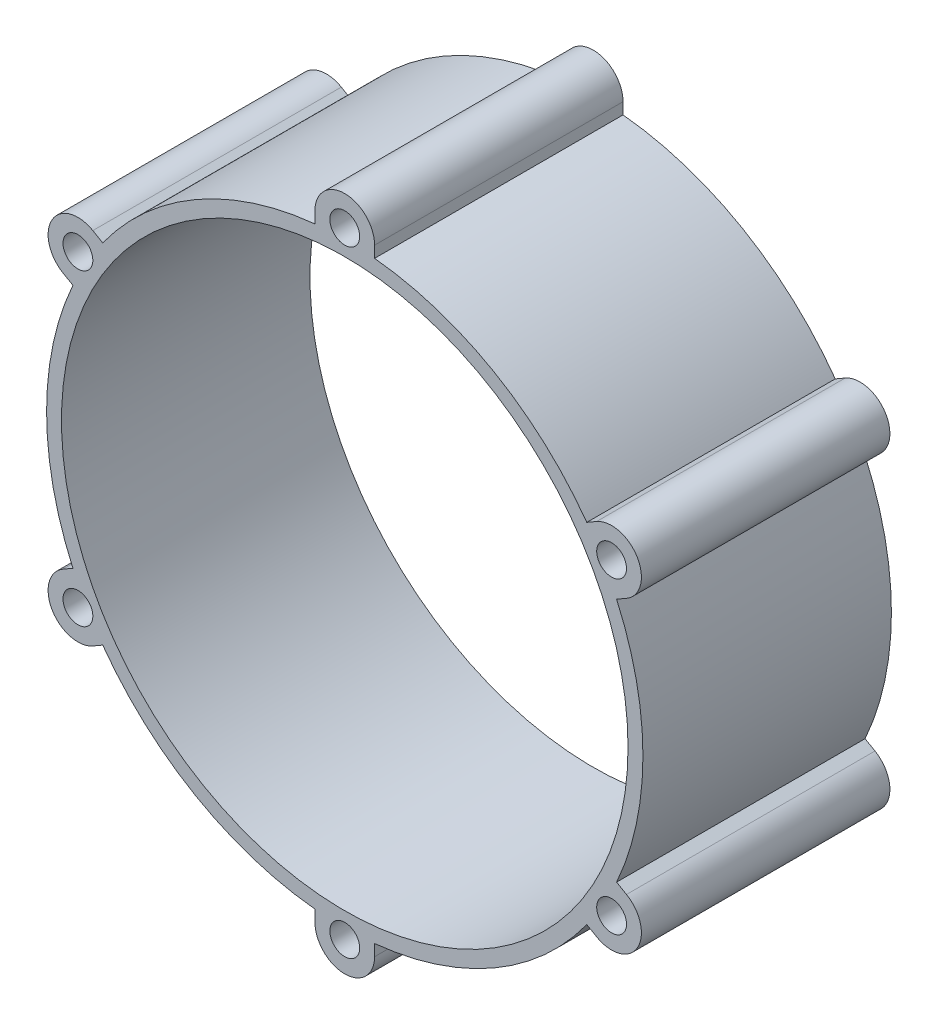
ISO-10303-21;
HEADER;
FILE_DESCRIPTION(('STEP AP214'),'2;1');
FILE_NAME('part.step','',(''),(''),'','','');
FILE_SCHEMA(('AUTOMOTIVE_DESIGN { 1 0 10303 214 1 1 1 1 }'));
ENDSEC;
DATA;
#1=APPLICATION_CONTEXT('core data for automotive mechanical design processes');
#2=APPLICATION_PROTOCOL_DEFINITION('international standard','automotive_design',2000,#1);
#3=PRODUCT_CONTEXT('',#1,'mechanical');
#4=PRODUCT('Part','Part','',(#3));
#5=PRODUCT_RELATED_PRODUCT_CATEGORY('part','',(#4));
#6=PRODUCT_DEFINITION_FORMATION('','',#4);
#7=PRODUCT_DEFINITION_CONTEXT('part definition',#1,'design');
#8=PRODUCT_DEFINITION('design','',#6,#7);
#9=PRODUCT_DEFINITION_SHAPE('','',#8);
#10=(LENGTH_UNIT() NAMED_UNIT(*) SI_UNIT(.MILLI.,.METRE.));
#11=(NAMED_UNIT(*) PLANE_ANGLE_UNIT() SI_UNIT($,.RADIAN.));
#12=(NAMED_UNIT(*) SI_UNIT($,.STERADIAN.) SOLID_ANGLE_UNIT());
#13=UNCERTAINTY_MEASURE_WITH_UNIT(LENGTH_MEASURE(1.E-05),#10,'distance_accuracy_value','');
#14=(GEOMETRIC_REPRESENTATION_CONTEXT(3) GLOBAL_UNCERTAINTY_ASSIGNED_CONTEXT((#13)) GLOBAL_UNIT_ASSIGNED_CONTEXT((#10,
#11,#12)) REPRESENTATION_CONTEXT('',''));
#15=CARTESIAN_POINT('',(0.,0.,0.));
#16=DIRECTION('',(0.,0.,1.));
#17=DIRECTION('',(1.,0.,0.));
#18=AXIS2_PLACEMENT_3D('',#15,#16,#17);
#19=CARTESIAN_POINT('',(0.,62.,25.));
#20=DIRECTION('',(0.,0.,-1.));
#21=DIRECTION('',(-1.,0.,0.));
#22=AXIS2_PLACEMENT_3D('',#19,#20,#21);
#23=CYLINDRICAL_SURFACE('',#22,6.);
#24=CARTESIAN_POINT('',(0.,62.,-25.));
#25=DIRECTION('',(0.,0.,1.));
#26=DIRECTION('',(1.,0.,0.));
#27=AXIS2_PLACEMENT_3D('',#24,#25,#26);
#28=CIRCLE('',#27,6.);
#29=CARTESIAN_POINT('',(6.,62.,-25.));
#30=VERTEX_POINT('',#29);
#31=CARTESIAN_POINT('',(-6.,62.,-25.));
#32=VERTEX_POINT('',#31);
#33=EDGE_CURVE('E427',#30,#32,#28,.T.);
#34=ORIENTED_EDGE('',*,*,#33,.T.);
#35=DIRECTION('',(0.,0.,-1.));
#36=VECTOR('',#35,1.);
#37=CARTESIAN_POINT('',(-6.,62.,25.));
#38=LINE('',#37,#36);
#39=CARTESIAN_POINT('',(-6.,62.,25.));
#40=VERTEX_POINT('',#39);
#41=EDGE_CURVE('E204',#40,#32,#38,.T.);
#42=ORIENTED_EDGE('',*,*,#41,.F.);
#43=CARTESIAN_POINT('',(0.,62.,25.));
#44=DIRECTION('',(0.,0.,1.));
#45=DIRECTION('',(1.,0.,0.));
#46=AXIS2_PLACEMENT_3D('',#43,#44,#45);
#47=CIRCLE('',#46,6.);
#48=CARTESIAN_POINT('',(6.,62.,25.));
#49=VERTEX_POINT('',#48);
#50=EDGE_CURVE('E418',#49,#40,#47,.T.);
#51=ORIENTED_EDGE('',*,*,#50,.F.);
#52=DIRECTION('',(0.,0.,-1.));
#53=VECTOR('',#52,1.);
#54=CARTESIAN_POINT('',(6.,62.,25.));
#55=LINE('',#54,#53);
#56=EDGE_CURVE('E12',#49,#30,#55,.T.);
#57=ORIENTED_EDGE('',*,*,#56,.T.);
#58=EDGE_LOOP('',(#34,#42,#51,#57));
#59=FACE_BOUND('',#58,.T.);
#60=ADVANCED_FACE('F194',(#59),#23,.T.);
#61=CARTESIAN_POINT('',(-5.99999999999986,0.,25.));
#62=DIRECTION('',(1.,0.,0.));
#63=DIRECTION('',(0.,1.,0.));
#64=AXIS2_PLACEMENT_3D('',#61,#62,#63);
#65=PLANE('',#64);
#66=DIRECTION('',(0.,-1.,0.));
#67=VECTOR('',#66,1.);
#68=CARTESIAN_POINT('',(-5.99999999999986,0.,-25.));
#69=LINE('',#68,#67);
#70=CARTESIAN_POINT('',(-6.,59.6992462263972,-25.));
#71=VERTEX_POINT('',#70);
#72=EDGE_CURVE('E419',#32,#71,#69,.T.);
#73=ORIENTED_EDGE('',*,*,#72,.T.);
#74=DIRECTION('',(0.,0.,-1.));
#75=VECTOR('',#74,1.);
#76=CARTESIAN_POINT('',(-6.,59.6992462263972,25.));
#77=LINE('',#76,#75);
#78=CARTESIAN_POINT('',(-6.,59.6992462263972,25.));
#79=VERTEX_POINT('',#78);
#80=EDGE_CURVE('E433',#79,#71,#77,.T.);
#81=ORIENTED_EDGE('',*,*,#80,.F.);
#82=DIRECTION('',(0.,-1.,0.));
#83=VECTOR('',#82,1.);
#84=CARTESIAN_POINT('',(-5.99999999999986,0.,25.));
#85=LINE('',#84,#83);
#86=EDGE_CURVE('E422',#40,#79,#85,.T.);
#87=ORIENTED_EDGE('',*,*,#86,.F.);
#88=ORIENTED_EDGE('',*,*,#41,.T.);
#89=EDGE_LOOP('',(#73,#81,#87,#88));
#90=FACE_BOUND('',#89,.T.);
#91=ADVANCED_FACE('F568',(#90),#65,.F.);
#92=CARTESIAN_POINT('',(5.99999999999986,0.,25.));
#93=DIRECTION('',(1.,0.,0.));
#94=DIRECTION('',(0.,1.,0.));
#95=AXIS2_PLACEMENT_3D('',#92,#93,#94);
#96=PLANE('',#95);
#97=DIRECTION('',(0.,-1.,0.));
#98=VECTOR('',#97,1.);
#99=CARTESIAN_POINT('',(5.99999999999986,0.,-25.));
#100=LINE('',#99,#98);
#101=CARTESIAN_POINT('',(6.,59.6992462263972,-25.));
#102=VERTEX_POINT('',#101);
#103=EDGE_CURVE('E425',#30,#102,#100,.T.);
#104=ORIENTED_EDGE('',*,*,#103,.F.);
#105=ORIENTED_EDGE('',*,*,#56,.F.);
#106=DIRECTION('',(0.,-1.,0.));
#107=VECTOR('',#106,1.);
#108=CARTESIAN_POINT('',(5.99999999999986,0.,25.));
#109=LINE('',#108,#107);
#110=CARTESIAN_POINT('',(6.,59.6992462263972,25.));
#111=VERTEX_POINT('',#110);
#112=EDGE_CURVE('E415',#49,#111,#109,.T.);
#113=ORIENTED_EDGE('',*,*,#112,.T.);
#114=DIRECTION('',(0.,0.,-1.));
#115=VECTOR('',#114,1.);
#116=CARTESIAN_POINT('',(6.,59.6992462263972,25.));
#117=LINE('',#116,#115);
#118=EDGE_CURVE('E213',#111,#102,#117,.T.);
#119=ORIENTED_EDGE('',*,*,#118,.T.);
#120=EDGE_LOOP('',(#104,#105,#113,#119));
#121=FACE_BOUND('',#120,.T.);
#122=ADVANCED_FACE('F574',(#121),#96,.T.);
#123=CARTESIAN_POINT('',(0.,0.,-25.));
#124=DIRECTION('',(0.,0.,1.));
#125=DIRECTION('',(1.,0.,0.));
#126=AXIS2_PLACEMENT_3D('',#123,#124,#125);
#127=PLANE('',#126);
#128=CARTESIAN_POINT('',(53.6935750346348,31.0000000000006,-25.));
#129=DIRECTION('',(0.,0.,-1.));
#130=DIRECTION('',(-0.50000000000001,0.866025403784433,0.));
#131=AXIS2_PLACEMENT_3D('',#128,#129,#130);
#132=CIRCLE('',#131,3.);
#133=CARTESIAN_POINT('',(52.1935750346348,33.5980762113539,-25.));
#134=VERTEX_POINT('',#133);
#135=EDGE_CURVE('E911',#134,#134,#132,.T.);
#136=ORIENTED_EDGE('',*,*,#135,.F.);
#137=EDGE_LOOP('',(#136));
#138=FACE_BOUND('',#137,.T.);
#139=CARTESIAN_POINT('',(53.6935750346355,-30.9999999999995,-25.));
#140=DIRECTION('',(0.,0.,-1.));
#141=DIRECTION('',(0.499999999999992,0.866025403784443,0.));
#142=AXIS2_PLACEMENT_3D('',#139,#140,#141);
#143=CIRCLE('',#142,3.);
#144=CARTESIAN_POINT('',(55.1935750346355,-28.4019237886462,-25.));
#145=VERTEX_POINT('',#144);
#146=EDGE_CURVE('E915',#145,#145,#143,.T.);
#147=ORIENTED_EDGE('',*,*,#146,.F.);
#148=EDGE_LOOP('',(#147));
#149=FACE_BOUND('',#148,.T.);
#150=CARTESIAN_POINT('',(0.,-62.,-25.));
#151=DIRECTION('',(0.,0.,-1.));
#152=DIRECTION('',(1.,0.,0.));
#153=AXIS2_PLACEMENT_3D('',#150,#151,#152);
#154=CIRCLE('',#153,3.);
#155=CARTESIAN_POINT('',(3.,-62.,-25.));
#156=VERTEX_POINT('',#155);
#157=EDGE_CURVE('E919',#156,#156,#154,.T.);
#158=ORIENTED_EDGE('',*,*,#157,.F.);
#159=EDGE_LOOP('',(#158));
#160=FACE_BOUND('',#159,.T.);
#161=CARTESIAN_POINT('',(-53.6935750346351,-31.0000000000003,-25.));
#162=DIRECTION('',(0.,0.,-1.));
#163=DIRECTION('',(0.500000000000004,-0.866025403784436,0.));
#164=AXIS2_PLACEMENT_3D('',#161,#162,#163);
#165=CIRCLE('',#164,3.);
#166=CARTESIAN_POINT('',(-52.193575034635,-33.5980762113536,-25.));
#167=VERTEX_POINT('',#166);
#168=EDGE_CURVE('E923',#167,#167,#165,.T.);
#169=ORIENTED_EDGE('',*,*,#168,.F.);
#170=EDGE_LOOP('',(#169));
#171=FACE_BOUND('',#170,.T.);
#172=CARTESIAN_POINT('',(-53.6935750346353,30.9999999999999,-25.));
#173=DIRECTION('',(0.,0.,-1.));
#174=DIRECTION('',(-0.499999999999998,-0.86602540378444,0.));
#175=AXIS2_PLACEMENT_3D('',#172,#173,#174);
#176=CIRCLE('',#175,3.);
#177=CARTESIAN_POINT('',(-55.1935750346353,28.4019237886466,-25.));
#178=VERTEX_POINT('',#177);
#179=EDGE_CURVE('E412',#178,#178,#176,.T.);
#180=ORIENTED_EDGE('',*,*,#179,.F.);
#181=EDGE_LOOP('',(#180));
#182=FACE_BOUND('',#181,.T.);
#183=CARTESIAN_POINT('',(0.,62.,-25.));
#184=DIRECTION('',(0.,0.,-1.));
#185=DIRECTION('',(-1.,0.,0.));
#186=AXIS2_PLACEMENT_3D('',#183,#184,#185);
#187=CIRCLE('',#186,3.);
#188=CARTESIAN_POINT('',(-3.,62.,-25.));
#189=VERTEX_POINT('',#188);
#190=EDGE_CURVE('E404',#189,#189,#187,.T.);
#191=ORIENTED_EDGE('',*,*,#190,.F.);
#192=EDGE_LOOP('',(#191));
#193=FACE_BOUND('',#192,.T.);
#194=ORIENTED_EDGE('',*,*,#103,.T.);
#195=CARTESIAN_POINT('',(0.,0.,-25.));
#196=DIRECTION('',(0.,0.,1.));
#197=DIRECTION('',(1.,0.,0.));
#198=AXIS2_PLACEMENT_3D('',#195,#196,#197);
#199=CIRCLE('',#198,60.);
#200=CARTESIAN_POINT('',(48.7010638188423,35.0457755359052,-25.));
#201=VERTEX_POINT('',#200);
#202=EDGE_CURVE('E198',#201,#102,#199,.T.);
#203=ORIENTED_EDGE('',*,*,#202,.F.);
#204=DIRECTION('',(-0.866025403784436,-0.500000000000005,0.));
#205=VECTOR('',#204,1.);
#206=CARTESIAN_POINT('',(-2.99999999999984,5.19615242270628,-25.));
#207=LINE('',#206,#205);
#208=CARTESIAN_POINT('',(50.6935750346352,36.1961524227066,-25.));
#209=VERTEX_POINT('',#208);
#210=EDGE_CURVE('E381',#209,#201,#207,.T.);
#211=ORIENTED_EDGE('',*,*,#210,.F.);
#212=CARTESIAN_POINT('',(53.6935750346352,31.,-25.));
#213=DIRECTION('',(0.,0.,1.));
#214=DIRECTION('',(1.,0.,0.));
#215=AXIS2_PLACEMENT_3D('',#212,#213,#214);
#216=CIRCLE('',#215,6.);
#217=CARTESIAN_POINT('',(56.6935750346352,25.8038475772934,-25.));
#218=VERTEX_POINT('',#217);
#219=EDGE_CURVE('E378',#218,#209,#216,.T.);
#220=ORIENTED_EDGE('',*,*,#219,.F.);
#221=DIRECTION('',(-0.86602540378444,-0.499999999999998,0.));
#222=VECTOR('',#221,1.);
#223=CARTESIAN_POINT('',(2.99999999999993,-5.19615242270654,-25.));
#224=LINE('',#223,#222);
#225=CARTESIAN_POINT('',(54.7010638188423,24.653470690492,-25.));
#226=VERTEX_POINT('',#225);
#227=EDGE_CURVE('E368',#218,#226,#224,.T.);
#228=ORIENTED_EDGE('',*,*,#227,.T.);
#229=CARTESIAN_POINT('',(54.7010638188423,-24.653470690492,-25.));
#230=VERTEX_POINT('',#229);
#231=EDGE_CURVE('E352',#230,#226,#199,.T.);
#232=ORIENTED_EDGE('',*,*,#231,.F.);
#233=DIRECTION('',(-0.86602540378444,0.499999999999998,0.));
#234=VECTOR('',#233,1.);
#235=CARTESIAN_POINT('',(2.99999999999992,5.19615242270652,-25.));
#236=LINE('',#235,#234);
#237=CARTESIAN_POINT('',(56.6935750346352,-25.8038475772934,-25.));
#238=VERTEX_POINT('',#237);
#239=EDGE_CURVE('E519',#238,#230,#236,.T.);
#240=ORIENTED_EDGE('',*,*,#239,.F.);
#241=CARTESIAN_POINT('',(53.6935750346352,-31.,-25.));
#242=DIRECTION('',(0.,0.,1.));
#243=DIRECTION('',(1.,0.,0.));
#244=AXIS2_PLACEMENT_3D('',#241,#242,#243);
#245=CIRCLE('',#244,6.);
#246=CARTESIAN_POINT('',(50.6935750346352,-36.1961524227067,-25.));
#247=VERTEX_POINT('',#246);
#248=EDGE_CURVE('E527',#247,#238,#245,.T.);
#249=ORIENTED_EDGE('',*,*,#248,.F.);
#250=DIRECTION('',(-0.866025403784437,0.500000000000003,0.));
#251=VECTOR('',#250,1.);
#252=CARTESIAN_POINT('',(-2.99999999999992,-5.19615242270645,-25.));
#253=LINE('',#252,#251);
#254=CARTESIAN_POINT('',(48.7010638188423,-35.0457755359053,-25.));
#255=VERTEX_POINT('',#254);
#256=EDGE_CURVE('E396',#247,#255,#253,.T.);
#257=ORIENTED_EDGE('',*,*,#256,.T.);
#258=CARTESIAN_POINT('',(6.,-59.6992462263972,-25.));
#259=VERTEX_POINT('',#258);
#260=EDGE_CURVE('E363',#259,#255,#199,.T.);
#261=ORIENTED_EDGE('',*,*,#260,.F.);
#262=DIRECTION('',(0.,1.,0.));
#263=VECTOR('',#262,1.);
#264=CARTESIAN_POINT('',(5.99999999999982,0.,-25.));
#265=LINE('',#264,#263);
#266=CARTESIAN_POINT('',(6.00000000000001,-62.0000000000001,-25.));
#267=VERTEX_POINT('',#266);
#268=EDGE_CURVE('E493',#267,#259,#265,.T.);
#269=ORIENTED_EDGE('',*,*,#268,.F.);
#270=CARTESIAN_POINT('',(0.,-62.0000000000001,-25.));
#271=DIRECTION('',(0.,0.,1.));
#272=DIRECTION('',(1.,0.,0.));
#273=AXIS2_PLACEMENT_3D('',#270,#271,#272);
#274=CIRCLE('',#273,6.);
#275=CARTESIAN_POINT('',(-6.,-62.0000000000001,-25.));
#276=VERTEX_POINT('',#275);
#277=EDGE_CURVE('E502',#276,#267,#274,.T.);
#278=ORIENTED_EDGE('',*,*,#277,.F.);
#279=DIRECTION('',(0.,1.,0.));
#280=VECTOR('',#279,1.);
#281=CARTESIAN_POINT('',(-5.99999999999981,0.,-25.));
#282=LINE('',#281,#280);
#283=CARTESIAN_POINT('',(-5.99999999999999,-59.6992462263972,-25.));
#284=VERTEX_POINT('',#283);
#285=EDGE_CURVE('E499',#276,#284,#282,.T.);
#286=ORIENTED_EDGE('',*,*,#285,.T.);
#287=CARTESIAN_POINT('',(-48.7010638188423,-35.0457755359053,-25.));
#288=VERTEX_POINT('',#287);
#289=EDGE_CURVE('E641',#288,#284,#199,.T.);
#290=ORIENTED_EDGE('',*,*,#289,.F.);
#291=DIRECTION('',(0.866025403784438,0.500000000000002,0.));
#292=VECTOR('',#291,1.);
#293=CARTESIAN_POINT('',(2.99999999999997,-5.19615242270656,-25.));
#294=LINE('',#293,#292);
#295=CARTESIAN_POINT('',(-50.6935750346352,-36.1961524227067,-25.));
#296=VERTEX_POINT('',#295);
#297=EDGE_CURVE('E467',#296,#288,#294,.T.);
#298=ORIENTED_EDGE('',*,*,#297,.F.);
#299=CARTESIAN_POINT('',(-53.6935750346352,-31.0000000000001,-25.));
#300=DIRECTION('',(0.,0.,1.));
#301=DIRECTION('',(1.,0.,0.));
#302=AXIS2_PLACEMENT_3D('',#299,#300,#301);
#303=CIRCLE('',#302,6.);
#304=CARTESIAN_POINT('',(-56.6935750346352,-25.8038475772934,-25.));
#305=VERTEX_POINT('',#304);
#306=EDGE_CURVE('E476',#305,#296,#303,.T.);
#307=ORIENTED_EDGE('',*,*,#306,.F.);
#308=DIRECTION('',(0.86602540378444,0.499999999999998,0.));
#309=VECTOR('',#308,1.);
#310=CARTESIAN_POINT('',(-2.99999999999991,5.19615242270649,-25.));
#311=LINE('',#310,#309);
#312=CARTESIAN_POINT('',(-54.7010638188423,-24.653470690492,-25.));
#313=VERTEX_POINT('',#312);
#314=EDGE_CURVE('E473',#305,#313,#311,.T.);
#315=ORIENTED_EDGE('',*,*,#314,.T.);
#316=CARTESIAN_POINT('',(-54.7010638188423,24.6534706904919,-25.));
#317=VERTEX_POINT('',#316);
#318=EDGE_CURVE('E638',#317,#313,#199,.T.);
#319=ORIENTED_EDGE('',*,*,#318,.F.);
#320=DIRECTION('',(0.86602540378444,-0.499999999999997,0.));
#321=VECTOR('',#320,1.);
#322=CARTESIAN_POINT('',(-2.99999999999992,-5.19615242270654,-25.));
#323=LINE('',#322,#321);
#324=CARTESIAN_POINT('',(-56.6935750346352,25.8038475772933,-25.));
#325=VERTEX_POINT('',#324);
#326=EDGE_CURVE('E441',#325,#317,#323,.T.);
#327=ORIENTED_EDGE('',*,*,#326,.F.);
#328=CARTESIAN_POINT('',(-53.6935750346352,30.9999999999999,-25.));
#329=DIRECTION('',(0.,0.,1.));
#330=DIRECTION('',(1.,0.,0.));
#331=AXIS2_PLACEMENT_3D('',#328,#329,#330);
#332=CIRCLE('',#331,6.);
#333=CARTESIAN_POINT('',(-50.6935750346353,36.1961524227066,-25.));
#334=VERTEX_POINT('',#333);
#335=EDGE_CURVE('E450',#334,#325,#332,.T.);
#336=ORIENTED_EDGE('',*,*,#335,.F.);
#337=DIRECTION('',(0.866025403784438,-0.500000000000002,0.));
#338=VECTOR('',#337,1.);
#339=CARTESIAN_POINT('',(2.99999999999991,5.19615242270645,-25.));
#340=LINE('',#339,#338);
#341=CARTESIAN_POINT('',(-48.7010638188423,35.0457755359052,-25.));
#342=VERTEX_POINT('',#341);
#343=EDGE_CURVE('E447',#334,#342,#340,.T.);
#344=ORIENTED_EDGE('',*,*,#343,.T.);
#345=EDGE_CURVE('E637',#71,#342,#199,.T.);
#346=ORIENTED_EDGE('',*,*,#345,.F.);
#347=ORIENTED_EDGE('',*,*,#72,.F.);
#348=ORIENTED_EDGE('',*,*,#33,.F.);
#349=EDGE_LOOP('',(#194,#203,#211,#220,#228,#232,#240,#249,#257,#261,#269,#278,#286,#290,#298,
#307,#315,#319,#327,#336,#344,#346,#347,#348));
#350=FACE_BOUND('',#349,.T.);
#351=CARTESIAN_POINT('',(0.,0.,-25.));
#352=DIRECTION('',(0.,0.,1.));
#353=DIRECTION('',(1.,0.,0.));
#354=AXIS2_PLACEMENT_3D('',#351,#352,#353);
#355=CIRCLE('',#354,57.);
#356=CARTESIAN_POINT('',(57.,0.,-25.));
#357=VERTEX_POINT('',#356);
#358=EDGE_CURVE('E399',#357,#357,#355,.T.);
#359=ORIENTED_EDGE('',*,*,#358,.T.);
#360=EDGE_LOOP('',(#359));
#361=FACE_BOUND('',#360,.T.);
#362=ADVANCED_FACE('F375',(#138,#149,#160,#171,#182,#193,#350,#361),#127,.F.);
#363=CARTESIAN_POINT('',(0.,0.,25.));
#364=DIRECTION('',(0.,0.,1.));
#365=DIRECTION('',(1.,0.,0.));
#366=AXIS2_PLACEMENT_3D('',#363,#364,#365);
#367=PLANE('',#366);
#368=CARTESIAN_POINT('',(53.6935750346348,31.0000000000006,25.));
#369=DIRECTION('',(0.,0.,-1.));
#370=DIRECTION('',(-0.50000000000001,0.866025403784433,0.));
#371=AXIS2_PLACEMENT_3D('',#368,#369,#370);
#372=CIRCLE('',#371,3.);
#373=CARTESIAN_POINT('',(52.1935750346348,33.5980762113539,25.));
#374=VERTEX_POINT('',#373);
#375=EDGE_CURVE('E946',#374,#374,#372,.T.);
#376=ORIENTED_EDGE('',*,*,#375,.T.);
#377=EDGE_LOOP('',(#376));
#378=FACE_BOUND('',#377,.T.);
#379=CARTESIAN_POINT('',(53.6935750346355,-30.9999999999995,25.));
#380=DIRECTION('',(0.,0.,-1.));
#381=DIRECTION('',(0.499999999999992,0.866025403784443,0.));
#382=AXIS2_PLACEMENT_3D('',#379,#380,#381);
#383=CIRCLE('',#382,3.);
#384=CARTESIAN_POINT('',(55.1935750346355,-28.4019237886462,25.));
#385=VERTEX_POINT('',#384);
#386=EDGE_CURVE('E942',#385,#385,#383,.T.);
#387=ORIENTED_EDGE('',*,*,#386,.T.);
#388=EDGE_LOOP('',(#387));
#389=FACE_BOUND('',#388,.T.);
#390=CARTESIAN_POINT('',(0.,-62.,25.));
#391=DIRECTION('',(0.,0.,-1.));
#392=DIRECTION('',(1.,0.,0.));
#393=AXIS2_PLACEMENT_3D('',#390,#391,#392);
#394=CIRCLE('',#393,3.);
#395=CARTESIAN_POINT('',(3.,-62.,25.));
#396=VERTEX_POINT('',#395);
#397=EDGE_CURVE('E936',#396,#396,#394,.T.);
#398=ORIENTED_EDGE('',*,*,#397,.T.);
#399=EDGE_LOOP('',(#398));
#400=FACE_BOUND('',#399,.T.);
#401=CARTESIAN_POINT('',(-53.6935750346351,-31.0000000000003,25.));
#402=DIRECTION('',(0.,0.,-1.));
#403=DIRECTION('',(0.500000000000004,-0.866025403784436,0.));
#404=AXIS2_PLACEMENT_3D('',#401,#402,#403);
#405=CIRCLE('',#404,3.);
#406=CARTESIAN_POINT('',(-52.193575034635,-33.5980762113536,25.));
#407=VERTEX_POINT('',#406);
#408=EDGE_CURVE('E930',#407,#407,#405,.T.);
#409=ORIENTED_EDGE('',*,*,#408,.T.);
#410=EDGE_LOOP('',(#409));
#411=FACE_BOUND('',#410,.T.);
#412=CARTESIAN_POINT('',(-53.6935750346353,30.9999999999999,25.));
#413=DIRECTION('',(0.,0.,-1.));
#414=DIRECTION('',(-0.499999999999998,-0.86602540378444,0.));
#415=AXIS2_PLACEMENT_3D('',#412,#413,#414);
#416=CIRCLE('',#415,3.);
#417=CARTESIAN_POINT('',(-55.1935750346353,28.4019237886466,25.));
#418=VERTEX_POINT('',#417);
#419=EDGE_CURVE('E409',#418,#418,#416,.T.);
#420=ORIENTED_EDGE('',*,*,#419,.T.);
#421=EDGE_LOOP('',(#420));
#422=FACE_BOUND('',#421,.T.);
#423=CARTESIAN_POINT('',(0.,62.,25.));
#424=DIRECTION('',(0.,0.,-1.));
#425=DIRECTION('',(-1.,0.,0.));
#426=AXIS2_PLACEMENT_3D('',#423,#424,#425);
#427=CIRCLE('',#426,3.);
#428=CARTESIAN_POINT('',(-3.,62.,25.));
#429=VERTEX_POINT('',#428);
#430=EDGE_CURVE('E401',#429,#429,#427,.T.);
#431=ORIENTED_EDGE('',*,*,#430,.T.);
#432=EDGE_LOOP('',(#431));
#433=FACE_BOUND('',#432,.T.);
#434=ORIENTED_EDGE('',*,*,#112,.F.);
#435=ORIENTED_EDGE('',*,*,#50,.T.);
#436=ORIENTED_EDGE('',*,*,#86,.T.);
#437=CARTESIAN_POINT('',(0.,0.,25.));
#438=DIRECTION('',(0.,0.,1.));
#439=DIRECTION('',(1.,0.,0.));
#440=AXIS2_PLACEMENT_3D('',#437,#438,#439);
#441=CIRCLE('',#440,60.);
#442=CARTESIAN_POINT('',(-48.7010638188423,35.0457755359052,25.));
#443=VERTEX_POINT('',#442);
#444=EDGE_CURVE('E383',#79,#443,#441,.T.);
#445=ORIENTED_EDGE('',*,*,#444,.T.);
#446=DIRECTION('',(0.866025403784438,-0.500000000000002,0.));
#447=VECTOR('',#446,1.);
#448=CARTESIAN_POINT('',(2.99999999999991,5.19615242270645,25.));
#449=LINE('',#448,#447);
#450=CARTESIAN_POINT('',(-50.6935750346353,36.1961524227066,25.));
#451=VERTEX_POINT('',#450);
#452=EDGE_CURVE('E437',#451,#443,#449,.T.);
#453=ORIENTED_EDGE('',*,*,#452,.F.);
#454=CARTESIAN_POINT('',(-53.6935750346352,30.9999999999999,25.));
#455=DIRECTION('',(0.,0.,1.));
#456=DIRECTION('',(1.,0.,0.));
#457=AXIS2_PLACEMENT_3D('',#454,#455,#456);
#458=CIRCLE('',#457,6.);
#459=CARTESIAN_POINT('',(-56.6935750346352,25.8038475772933,25.));
#460=VERTEX_POINT('',#459);
#461=EDGE_CURVE('E440',#451,#460,#458,.T.);
#462=ORIENTED_EDGE('',*,*,#461,.T.);
#463=DIRECTION('',(0.86602540378444,-0.499999999999997,0.));
#464=VECTOR('',#463,1.);
#465=CARTESIAN_POINT('',(-2.99999999999992,-5.19615242270654,25.));
#466=LINE('',#465,#464);
#467=CARTESIAN_POINT('',(-54.7010638188423,24.6534706904919,25.));
#468=VERTEX_POINT('',#467);
#469=EDGE_CURVE('E443',#460,#468,#466,.T.);
#470=ORIENTED_EDGE('',*,*,#469,.T.);
#471=CARTESIAN_POINT('',(-54.7010638188423,-24.653470690492,25.));
#472=VERTEX_POINT('',#471);
#473=EDGE_CURVE('E665',#468,#472,#441,.T.);
#474=ORIENTED_EDGE('',*,*,#473,.T.);
#475=DIRECTION('',(0.86602540378444,0.499999999999998,0.));
#476=VECTOR('',#475,1.);
#477=CARTESIAN_POINT('',(-2.99999999999991,5.19615242270649,25.));
#478=LINE('',#477,#476);
#479=CARTESIAN_POINT('',(-56.6935750346352,-25.8038475772934,25.));
#480=VERTEX_POINT('',#479);
#481=EDGE_CURVE('E463',#480,#472,#478,.T.);
#482=ORIENTED_EDGE('',*,*,#481,.F.);
#483=CARTESIAN_POINT('',(-53.6935750346352,-31.0000000000001,25.));
#484=DIRECTION('',(0.,0.,1.));
#485=DIRECTION('',(1.,0.,0.));
#486=AXIS2_PLACEMENT_3D('',#483,#484,#485);
#487=CIRCLE('',#486,6.);
#488=CARTESIAN_POINT('',(-50.6935750346352,-36.1961524227067,25.));
#489=VERTEX_POINT('',#488);
#490=EDGE_CURVE('E466',#480,#489,#487,.T.);
#491=ORIENTED_EDGE('',*,*,#490,.T.);
#492=DIRECTION('',(0.866025403784438,0.500000000000002,0.));
#493=VECTOR('',#492,1.);
#494=CARTESIAN_POINT('',(2.99999999999997,-5.19615242270656,25.));
#495=LINE('',#494,#493);
#496=CARTESIAN_POINT('',(-48.7010638188423,-35.0457755359053,25.));
#497=VERTEX_POINT('',#496);
#498=EDGE_CURVE('E469',#489,#497,#495,.T.);
#499=ORIENTED_EDGE('',*,*,#498,.T.);
#500=CARTESIAN_POINT('',(-5.99999999999999,-59.6992462263972,25.));
#501=VERTEX_POINT('',#500);
#502=EDGE_CURVE('E636',#497,#501,#441,.T.);
#503=ORIENTED_EDGE('',*,*,#502,.T.);
#504=DIRECTION('',(0.,1.,0.));
#505=VECTOR('',#504,1.);
#506=CARTESIAN_POINT('',(-5.99999999999981,0.,25.));
#507=LINE('',#506,#505);
#508=CARTESIAN_POINT('',(-6.,-62.0000000000001,25.));
#509=VERTEX_POINT('',#508);
#510=EDGE_CURVE('E489',#509,#501,#507,.T.);
#511=ORIENTED_EDGE('',*,*,#510,.F.);
#512=CARTESIAN_POINT('',(0.,-62.0000000000001,25.));
#513=DIRECTION('',(0.,0.,1.));
#514=DIRECTION('',(1.,0.,0.));
#515=AXIS2_PLACEMENT_3D('',#512,#513,#514);
#516=CIRCLE('',#515,6.);
#517=CARTESIAN_POINT('',(6.00000000000001,-62.0000000000001,25.));
#518=VERTEX_POINT('',#517);
#519=EDGE_CURVE('E492',#509,#518,#516,.T.);
#520=ORIENTED_EDGE('',*,*,#519,.T.);
#521=DIRECTION('',(0.,1.,0.));
#522=VECTOR('',#521,1.);
#523=CARTESIAN_POINT('',(5.99999999999982,0.,25.));
#524=LINE('',#523,#522);
#525=CARTESIAN_POINT('',(6.,-59.6992462263972,25.));
#526=VERTEX_POINT('',#525);
#527=EDGE_CURVE('E495',#518,#526,#524,.T.);
#528=ORIENTED_EDGE('',*,*,#527,.T.);
#529=CARTESIAN_POINT('',(48.7010638188423,-35.0457755359053,25.));
#530=VERTEX_POINT('',#529);
#531=EDGE_CURVE('E635',#526,#530,#441,.T.);
#532=ORIENTED_EDGE('',*,*,#531,.T.);
#533=DIRECTION('',(-0.866025403784437,0.500000000000003,0.));
#534=VECTOR('',#533,1.);
#535=CARTESIAN_POINT('',(-2.99999999999992,-5.19615242270645,25.));
#536=LINE('',#535,#534);
#537=CARTESIAN_POINT('',(50.6935750346352,-36.1961524227067,25.));
#538=VERTEX_POINT('',#537);
#539=EDGE_CURVE('E515',#538,#530,#536,.T.);
#540=ORIENTED_EDGE('',*,*,#539,.F.);
#541=CARTESIAN_POINT('',(53.6935750346352,-31.,25.));
#542=DIRECTION('',(0.,0.,1.));
#543=DIRECTION('',(1.,0.,0.));
#544=AXIS2_PLACEMENT_3D('',#541,#542,#543);
#545=CIRCLE('',#544,6.);
#546=CARTESIAN_POINT('',(56.6935750346352,-25.8038475772934,25.));
#547=VERTEX_POINT('',#546);
#548=EDGE_CURVE('E518',#538,#547,#545,.T.);
#549=ORIENTED_EDGE('',*,*,#548,.T.);
#550=DIRECTION('',(-0.86602540378444,0.499999999999998,0.));
#551=VECTOR('',#550,1.);
#552=CARTESIAN_POINT('',(2.99999999999992,5.19615242270652,25.));
#553=LINE('',#552,#551);
#554=CARTESIAN_POINT('',(54.7010638188423,-24.653470690492,25.));
#555=VERTEX_POINT('',#554);
#556=EDGE_CURVE('E521',#547,#555,#553,.T.);
#557=ORIENTED_EDGE('',*,*,#556,.T.);
#558=CARTESIAN_POINT('',(54.7010638188423,24.653470690492,25.));
#559=VERTEX_POINT('',#558);
#560=EDGE_CURVE('E384',#555,#559,#441,.T.);
#561=ORIENTED_EDGE('',*,*,#560,.T.);
#562=DIRECTION('',(-0.86602540378444,-0.499999999999998,0.));
#563=VECTOR('',#562,1.);
#564=CARTESIAN_POINT('',(2.99999999999993,-5.19615242270654,25.));
#565=LINE('',#564,#563);
#566=CARTESIAN_POINT('',(56.6935750346352,25.8038475772934,25.));
#567=VERTEX_POINT('',#566);
#568=EDGE_CURVE('E370',#567,#559,#565,.T.);
#569=ORIENTED_EDGE('',*,*,#568,.F.);
#570=CARTESIAN_POINT('',(53.6935750346352,31.,25.));
#571=DIRECTION('',(0.,0.,1.));
#572=DIRECTION('',(1.,0.,0.));
#573=AXIS2_PLACEMENT_3D('',#570,#571,#572);
#574=CIRCLE('',#573,6.);
#575=CARTESIAN_POINT('',(50.6935750346352,36.1961524227066,25.));
#576=VERTEX_POINT('',#575);
#577=EDGE_CURVE('E537',#567,#576,#574,.T.);
#578=ORIENTED_EDGE('',*,*,#577,.T.);
#579=DIRECTION('',(-0.866025403784436,-0.500000000000005,0.));
#580=VECTOR('',#579,1.);
#581=CARTESIAN_POINT('',(-2.99999999999984,5.19615242270628,25.));
#582=LINE('',#581,#580);
#583=CARTESIAN_POINT('',(48.7010638188423,35.0457755359052,25.));
#584=VERTEX_POINT('',#583);
#585=EDGE_CURVE('E371',#576,#584,#582,.T.);
#586=ORIENTED_EDGE('',*,*,#585,.T.);
#587=EDGE_CURVE('E379',#584,#111,#441,.T.);
#588=ORIENTED_EDGE('',*,*,#587,.T.);
#589=EDGE_LOOP('',(#434,#435,#436,#445,#453,#462,#470,#474,#482,#491,#499,#503,#511,#520,#528,
#532,#540,#549,#557,#561,#569,#578,#586,#588));
#590=FACE_BOUND('',#589,.T.);
#591=CARTESIAN_POINT('',(0.,0.,25.));
#592=DIRECTION('',(0.,0.,1.));
#593=DIRECTION('',(1.,0.,0.));
#594=AXIS2_PLACEMENT_3D('',#591,#592,#593);
#595=CIRCLE('',#594,57.);
#596=CARTESIAN_POINT('',(57.,0.,25.));
#597=VERTEX_POINT('',#596);
#598=EDGE_CURVE('E364',#597,#597,#595,.T.);
#599=ORIENTED_EDGE('',*,*,#598,.F.);
#600=EDGE_LOOP('',(#599));
#601=FACE_BOUND('',#600,.T.);
#602=ADVANCED_FACE('F544',(#378,#389,#400,#411,#422,#433,#590,#601),#367,.T.);
#603=CARTESIAN_POINT('',(-53.6935750346352,30.9999999999999,25.));
#604=DIRECTION('',(0.,0.,-1.));
#605=DIRECTION('',(-1.,0.,0.));
#606=AXIS2_PLACEMENT_3D('',#603,#604,#605);
#607=CYLINDRICAL_SURFACE('',#606,6.);
#608=ORIENTED_EDGE('',*,*,#335,.T.);
#609=DIRECTION('',(0.,0.,-1.));
#610=VECTOR('',#609,1.);
#611=CARTESIAN_POINT('',(-56.6935750346352,25.8038475772933,25.));
#612=LINE('',#611,#610);
#613=EDGE_CURVE('E459',#460,#325,#612,.T.);
#614=ORIENTED_EDGE('',*,*,#613,.F.);
#615=ORIENTED_EDGE('',*,*,#461,.F.);
#616=DIRECTION('',(0.,0.,-1.));
#617=VECTOR('',#616,1.);
#618=CARTESIAN_POINT('',(-50.6935750346353,36.1961524227066,25.));
#619=LINE('',#618,#617);
#620=EDGE_CURVE('E428',#451,#334,#619,.T.);
#621=ORIENTED_EDGE('',*,*,#620,.T.);
#622=EDGE_LOOP('',(#608,#614,#615,#621));
#623=FACE_BOUND('',#622,.T.);
#624=ADVANCED_FACE('F557',(#623),#607,.T.);
#625=CARTESIAN_POINT('',(-2.99999999999992,-5.19615242270654,25.));
#626=DIRECTION('',(0.499999999999997,0.86602540378444,0.));
#627=DIRECTION('',(-0.86602540378444,0.499999999999997,0.));
#628=AXIS2_PLACEMENT_3D('',#625,#626,#627);
#629=PLANE('',#628);
#630=ORIENTED_EDGE('',*,*,#326,.T.);
#631=DIRECTION('',(0.,0.,-1.));
#632=VECTOR('',#631,1.);
#633=CARTESIAN_POINT('',(-54.7010638188423,24.6534706904919,25.));
#634=LINE('',#633,#632);
#635=EDGE_CURVE('E457',#468,#317,#634,.T.);
#636=ORIENTED_EDGE('',*,*,#635,.F.);
#637=ORIENTED_EDGE('',*,*,#469,.F.);
#638=ORIENTED_EDGE('',*,*,#613,.T.);
#639=EDGE_LOOP('',(#630,#636,#637,#638));
#640=FACE_BOUND('',#639,.T.);
#641=ADVANCED_FACE('F582',(#640),#629,.F.);
#642=CARTESIAN_POINT('',(-53.6935750346352,-31.0000000000001,25.));
#643=DIRECTION('',(0.,0.,-1.));
#644=DIRECTION('',(-1.,0.,0.));
#645=AXIS2_PLACEMENT_3D('',#642,#643,#644);
#646=CYLINDRICAL_SURFACE('',#645,6.);
#647=ORIENTED_EDGE('',*,*,#306,.T.);
#648=DIRECTION('',(0.,0.,-1.));
#649=VECTOR('',#648,1.);
#650=CARTESIAN_POINT('',(-50.6935750346352,-36.1961524227067,25.));
#651=LINE('',#650,#649);
#652=EDGE_CURVE('E485',#489,#296,#651,.T.);
#653=ORIENTED_EDGE('',*,*,#652,.F.);
#654=ORIENTED_EDGE('',*,*,#490,.F.);
#655=DIRECTION('',(0.,0.,-1.));
#656=VECTOR('',#655,1.);
#657=CARTESIAN_POINT('',(-56.6935750346352,-25.8038475772934,25.));
#658=LINE('',#657,#656);
#659=EDGE_CURVE('E451',#480,#305,#658,.T.);
#660=ORIENTED_EDGE('',*,*,#659,.T.);
#661=EDGE_LOOP('',(#647,#653,#654,#660));
#662=FACE_BOUND('',#661,.T.);
#663=ADVANCED_FACE('F585',(#662),#646,.T.);
#664=CARTESIAN_POINT('',(-2.99999999999991,5.19615242270649,25.));
#665=DIRECTION('',(-0.499999999999998,0.86602540378444,0.));
#666=DIRECTION('',(-0.86602540378444,-0.499999999999998,0.));
#667=AXIS2_PLACEMENT_3D('',#664,#665,#666);
#668=PLANE('',#667);
#669=ORIENTED_EDGE('',*,*,#314,.F.);
#670=ORIENTED_EDGE('',*,*,#659,.F.);
#671=ORIENTED_EDGE('',*,*,#481,.T.);
#672=DIRECTION('',(0.,0.,-1.));
#673=VECTOR('',#672,1.);
#674=CARTESIAN_POINT('',(-54.7010638188423,-24.653470690492,25.));
#675=LINE('',#674,#673);
#676=EDGE_CURVE('E472',#472,#313,#675,.T.);
#677=ORIENTED_EDGE('',*,*,#676,.T.);
#678=EDGE_LOOP('',(#669,#670,#671,#677));
#679=FACE_BOUND('',#678,.T.);
#680=ADVANCED_FACE('F597',(#679),#668,.T.);
#681=CARTESIAN_POINT('',(2.99999999999997,-5.19615242270656,25.));
#682=DIRECTION('',(-0.500000000000002,0.866025403784438,0.));
#683=DIRECTION('',(-0.866025403784438,-0.500000000000002,0.));
#684=AXIS2_PLACEMENT_3D('',#681,#682,#683);
#685=PLANE('',#684);
#686=ORIENTED_EDGE('',*,*,#297,.T.);
#687=DIRECTION('',(0.,0.,-1.));
#688=VECTOR('',#687,1.);
#689=CARTESIAN_POINT('',(-48.7010638188423,-35.0457755359053,25.));
#690=LINE('',#689,#688);
#691=EDGE_CURVE('E483',#497,#288,#690,.T.);
#692=ORIENTED_EDGE('',*,*,#691,.F.);
#693=ORIENTED_EDGE('',*,*,#498,.F.);
#694=ORIENTED_EDGE('',*,*,#652,.T.);
#695=EDGE_LOOP('',(#686,#692,#693,#694));
#696=FACE_BOUND('',#695,.T.);
#697=ADVANCED_FACE('F593',(#696),#685,.F.);
#698=CARTESIAN_POINT('',(0.,-62.0000000000001,25.));
#699=DIRECTION('',(0.,0.,-1.));
#700=DIRECTION('',(-1.,0.,0.));
#701=AXIS2_PLACEMENT_3D('',#698,#699,#700);
#702=CYLINDRICAL_SURFACE('',#701,6.);
#703=ORIENTED_EDGE('',*,*,#277,.T.);
#704=DIRECTION('',(0.,0.,-1.));
#705=VECTOR('',#704,1.);
#706=CARTESIAN_POINT('',(6.00000000000001,-62.0000000000001,25.));
#707=LINE('',#706,#705);
#708=EDGE_CURVE('E511',#518,#267,#707,.T.);
#709=ORIENTED_EDGE('',*,*,#708,.F.);
#710=ORIENTED_EDGE('',*,*,#519,.F.);
#711=DIRECTION('',(0.,0.,-1.));
#712=VECTOR('',#711,1.);
#713=CARTESIAN_POINT('',(-6.,-62.0000000000001,25.));
#714=LINE('',#713,#712);
#715=EDGE_CURVE('E477',#509,#276,#714,.T.);
#716=ORIENTED_EDGE('',*,*,#715,.T.);
#717=EDGE_LOOP('',(#703,#709,#710,#716));
#718=FACE_BOUND('',#717,.T.);
#719=ADVANCED_FACE('F596',(#718),#702,.T.);
#720=CARTESIAN_POINT('',(-5.99999999999981,0.,25.));
#721=DIRECTION('',(-1.,0.,0.));
#722=DIRECTION('',(0.,-1.,0.));
#723=AXIS2_PLACEMENT_3D('',#720,#721,#722);
#724=PLANE('',#723);
#725=ORIENTED_EDGE('',*,*,#285,.F.);
#726=ORIENTED_EDGE('',*,*,#715,.F.);
#727=ORIENTED_EDGE('',*,*,#510,.T.);
#728=DIRECTION('',(0.,0.,-1.));
#729=VECTOR('',#728,1.);
#730=CARTESIAN_POINT('',(-5.99999999999999,-59.6992462263972,25.));
#731=LINE('',#730,#729);
#732=EDGE_CURVE('E498',#501,#284,#731,.T.);
#733=ORIENTED_EDGE('',*,*,#732,.T.);
#734=EDGE_LOOP('',(#725,#726,#727,#733));
#735=FACE_BOUND('',#734,.T.);
#736=ADVANCED_FACE('F610',(#735),#724,.T.);
#737=CARTESIAN_POINT('',(5.99999999999982,0.,25.));
#738=DIRECTION('',(-1.,0.,0.));
#739=DIRECTION('',(0.,-1.,0.));
#740=AXIS2_PLACEMENT_3D('',#737,#738,#739);
#741=PLANE('',#740);
#742=ORIENTED_EDGE('',*,*,#268,.T.);
#743=DIRECTION('',(0.,0.,-1.));
#744=VECTOR('',#743,1.);
#745=CARTESIAN_POINT('',(6.,-59.6992462263972,25.));
#746=LINE('',#745,#744);
#747=EDGE_CURVE('E509',#526,#259,#746,.T.);
#748=ORIENTED_EDGE('',*,*,#747,.F.);
#749=ORIENTED_EDGE('',*,*,#527,.F.);
#750=ORIENTED_EDGE('',*,*,#708,.T.);
#751=EDGE_LOOP('',(#742,#748,#749,#750));
#752=FACE_BOUND('',#751,.T.);
#753=ADVANCED_FACE('F606',(#752),#741,.F.);
#754=CARTESIAN_POINT('',(53.6935750346352,-31.,25.));
#755=DIRECTION('',(0.,0.,-1.));
#756=DIRECTION('',(-1.,0.,0.));
#757=AXIS2_PLACEMENT_3D('',#754,#755,#756);
#758=CYLINDRICAL_SURFACE('',#757,6.);
#759=ORIENTED_EDGE('',*,*,#248,.T.);
#760=DIRECTION('',(0.,0.,-1.));
#761=VECTOR('',#760,1.);
#762=CARTESIAN_POINT('',(56.6935750346352,-25.8038475772934,25.));
#763=LINE('',#762,#761);
#764=EDGE_CURVE('E533',#547,#238,#763,.T.);
#765=ORIENTED_EDGE('',*,*,#764,.F.);
#766=ORIENTED_EDGE('',*,*,#548,.F.);
#767=DIRECTION('',(0.,0.,-1.));
#768=VECTOR('',#767,1.);
#769=CARTESIAN_POINT('',(50.6935750346352,-36.1961524227067,25.));
#770=LINE('',#769,#768);
#771=EDGE_CURVE('E503',#538,#247,#770,.T.);
#772=ORIENTED_EDGE('',*,*,#771,.T.);
#773=EDGE_LOOP('',(#759,#765,#766,#772));
#774=FACE_BOUND('',#773,.T.);
#775=ADVANCED_FACE('F609',(#774),#758,.T.);
#776=CARTESIAN_POINT('',(-2.99999999999992,-5.19615242270645,25.));
#777=DIRECTION('',(-0.500000000000003,-0.866025403784437,0.));
#778=DIRECTION('',(0.866025403784437,-0.500000000000003,0.));
#779=AXIS2_PLACEMENT_3D('',#776,#777,#778);
#780=PLANE('',#779);
#781=ORIENTED_EDGE('',*,*,#256,.F.);
#782=ORIENTED_EDGE('',*,*,#771,.F.);
#783=ORIENTED_EDGE('',*,*,#539,.T.);
#784=DIRECTION('',(0.,0.,-1.));
#785=VECTOR('',#784,1.);
#786=CARTESIAN_POINT('',(48.7010638188423,-35.0457755359053,25.));
#787=LINE('',#786,#785);
#788=EDGE_CURVE('E524',#530,#255,#787,.T.);
#789=ORIENTED_EDGE('',*,*,#788,.T.);
#790=EDGE_LOOP('',(#781,#782,#783,#789));
#791=FACE_BOUND('',#790,.T.);
#792=ADVANCED_FACE('F564',(#791),#780,.T.);
#793=CARTESIAN_POINT('',(2.99999999999992,5.19615242270652,25.));
#794=DIRECTION('',(-0.499999999999998,-0.86602540378444,0.));
#795=DIRECTION('',(0.86602540378444,-0.499999999999998,0.));
#796=AXIS2_PLACEMENT_3D('',#793,#794,#795);
#797=PLANE('',#796);
#798=ORIENTED_EDGE('',*,*,#239,.T.);
#799=DIRECTION('',(0.,0.,-1.));
#800=VECTOR('',#799,1.);
#801=CARTESIAN_POINT('',(54.7010638188423,-24.653470690492,25.));
#802=LINE('',#801,#800);
#803=EDGE_CURVE('E358',#555,#230,#802,.T.);
#804=ORIENTED_EDGE('',*,*,#803,.F.);
#805=ORIENTED_EDGE('',*,*,#556,.F.);
#806=ORIENTED_EDGE('',*,*,#764,.T.);
#807=EDGE_LOOP('',(#798,#804,#805,#806));
#808=FACE_BOUND('',#807,.T.);
#809=ADVANCED_FACE('F618',(#808),#797,.F.);
#810=CARTESIAN_POINT('',(53.6935750346352,31.,25.));
#811=DIRECTION('',(0.,0.,-1.));
#812=DIRECTION('',(-1.,0.,0.));
#813=AXIS2_PLACEMENT_3D('',#810,#811,#812);
#814=CYLINDRICAL_SURFACE('',#813,6.);
#815=ORIENTED_EDGE('',*,*,#219,.T.);
#816=DIRECTION('',(0.,0.,-1.));
#817=VECTOR('',#816,1.);
#818=CARTESIAN_POINT('',(50.6935750346352,36.1961524227066,25.));
#819=LINE('',#818,#817);
#820=EDGE_CURVE('E391',#576,#209,#819,.T.);
#821=ORIENTED_EDGE('',*,*,#820,.F.);
#822=ORIENTED_EDGE('',*,*,#577,.F.);
#823=DIRECTION('',(0.,0.,-1.));
#824=VECTOR('',#823,1.);
#825=CARTESIAN_POINT('',(56.6935750346352,25.8038475772934,25.));
#826=LINE('',#825,#824);
#827=EDGE_CURVE('E394',#567,#218,#826,.T.);
#828=ORIENTED_EDGE('',*,*,#827,.T.);
#829=EDGE_LOOP('',(#815,#821,#822,#828));
#830=FACE_BOUND('',#829,.T.);
#831=ADVANCED_FACE('F563',(#830),#814,.T.);
#832=CARTESIAN_POINT('',(2.99999999999993,-5.19615242270654,25.));
#833=DIRECTION('',(0.499999999999998,-0.86602540378444,0.));
#834=DIRECTION('',(0.86602540378444,0.499999999999998,0.));
#835=AXIS2_PLACEMENT_3D('',#832,#833,#834);
#836=PLANE('',#835);
#837=ORIENTED_EDGE('',*,*,#227,.F.);
#838=ORIENTED_EDGE('',*,*,#827,.F.);
#839=ORIENTED_EDGE('',*,*,#568,.T.);
#840=DIRECTION('',(0.,0.,-1.));
#841=VECTOR('',#840,1.);
#842=CARTESIAN_POINT('',(54.7010638188423,24.653470690492,25.));
#843=LINE('',#842,#841);
#844=EDGE_CURVE('E356',#559,#226,#843,.T.);
#845=ORIENTED_EDGE('',*,*,#844,.T.);
#846=EDGE_LOOP('',(#837,#838,#839,#845));
#847=FACE_BOUND('',#846,.T.);
#848=ADVANCED_FACE('F367',(#847),#836,.T.);
#849=CARTESIAN_POINT('',(-2.99999999999984,5.19615242270628,25.));
#850=DIRECTION('',(0.500000000000005,-0.866025403784436,0.));
#851=DIRECTION('',(0.866025403784436,0.500000000000005,0.));
#852=AXIS2_PLACEMENT_3D('',#849,#850,#851);
#853=PLANE('',#852);
#854=ORIENTED_EDGE('',*,*,#210,.T.);
#855=DIRECTION('',(0.,0.,-1.));
#856=VECTOR('',#855,1.);
#857=CARTESIAN_POINT('',(48.7010638188423,35.0457755359052,25.));
#858=LINE('',#857,#856);
#859=EDGE_CURVE('E346',#584,#201,#858,.T.);
#860=ORIENTED_EDGE('',*,*,#859,.F.);
#861=ORIENTED_EDGE('',*,*,#585,.F.);
#862=ORIENTED_EDGE('',*,*,#820,.T.);
#863=EDGE_LOOP('',(#854,#860,#861,#862));
#864=FACE_BOUND('',#863,.T.);
#865=ADVANCED_FACE('F547',(#864),#853,.F.);
#866=CARTESIAN_POINT('',(2.99999999999991,5.19615242270645,25.));
#867=DIRECTION('',(0.500000000000002,0.866025403784438,0.));
#868=DIRECTION('',(-0.866025403784438,0.500000000000002,0.));
#869=AXIS2_PLACEMENT_3D('',#866,#867,#868);
#870=PLANE('',#869);
#871=ORIENTED_EDGE('',*,*,#343,.F.);
#872=ORIENTED_EDGE('',*,*,#620,.F.);
#873=ORIENTED_EDGE('',*,*,#452,.T.);
#874=DIRECTION('',(0.,0.,-1.));
#875=VECTOR('',#874,1.);
#876=CARTESIAN_POINT('',(-48.7010638188423,35.0457755359052,25.));
#877=LINE('',#876,#875);
#878=EDGE_CURVE('E446',#443,#342,#877,.T.);
#879=ORIENTED_EDGE('',*,*,#878,.T.);
#880=EDGE_LOOP('',(#871,#872,#873,#879));
#881=FACE_BOUND('',#880,.T.);
#882=ADVANCED_FACE('F558',(#881),#870,.T.);
#883=CARTESIAN_POINT('',(0.,0.,25.));
#884=DIRECTION('',(0.,0.,-1.));
#885=DIRECTION('',(-1.,0.,0.));
#886=AXIS2_PLACEMENT_3D('',#883,#884,#885);
#887=CYLINDRICAL_SURFACE('',#886,57.);
#888=ORIENTED_EDGE('',*,*,#598,.T.);
#889=EDGE_LOOP('',(#888));
#890=FACE_BOUND('',#889,.T.);
#891=ORIENTED_EDGE('',*,*,#358,.F.);
#892=EDGE_LOOP('',(#891));
#893=FACE_BOUND('',#892,.T.);
#894=ADVANCED_FACE('F550',(#890,#893),#887,.F.);
#895=CARTESIAN_POINT('',(0.,0.,25.));
#896=DIRECTION('',(0.,0.,-1.));
#897=DIRECTION('',(-1.,0.,0.));
#898=AXIS2_PLACEMENT_3D('',#895,#896,#897);
#899=CYLINDRICAL_SURFACE('',#898,60.);
#900=ORIENTED_EDGE('',*,*,#118,.F.);
#901=ORIENTED_EDGE('',*,*,#587,.F.);
#902=ORIENTED_EDGE('',*,*,#859,.T.);
#903=ORIENTED_EDGE('',*,*,#202,.T.);
#904=EDGE_LOOP('',(#900,#901,#902,#903));
#905=FACE_BOUND('',#904,.T.);
#906=ADVANCED_FACE('F196',(#905),#899,.T.);
#907=ORIENTED_EDGE('',*,*,#444,.F.);
#908=ORIENTED_EDGE('',*,*,#80,.T.);
#909=ORIENTED_EDGE('',*,*,#345,.T.);
#910=ORIENTED_EDGE('',*,*,#878,.F.);
#911=EDGE_LOOP('',(#907,#908,#909,#910));
#912=FACE_BOUND('',#911,.T.);
#913=ADVANCED_FACE('F549',(#912),#899,.T.);
#914=ORIENTED_EDGE('',*,*,#473,.F.);
#915=ORIENTED_EDGE('',*,*,#635,.T.);
#916=ORIENTED_EDGE('',*,*,#318,.T.);
#917=ORIENTED_EDGE('',*,*,#676,.F.);
#918=EDGE_LOOP('',(#914,#915,#916,#917));
#919=FACE_BOUND('',#918,.T.);
#920=ADVANCED_FACE('F555',(#919),#899,.T.);
#921=ORIENTED_EDGE('',*,*,#502,.F.);
#922=ORIENTED_EDGE('',*,*,#691,.T.);
#923=ORIENTED_EDGE('',*,*,#289,.T.);
#924=ORIENTED_EDGE('',*,*,#732,.F.);
#925=EDGE_LOOP('',(#921,#922,#923,#924));
#926=FACE_BOUND('',#925,.T.);
#927=ADVANCED_FACE('F605',(#926),#899,.T.);
#928=ORIENTED_EDGE('',*,*,#531,.F.);
#929=ORIENTED_EDGE('',*,*,#747,.T.);
#930=ORIENTED_EDGE('',*,*,#260,.T.);
#931=ORIENTED_EDGE('',*,*,#788,.F.);
#932=EDGE_LOOP('',(#928,#929,#930,#931));
#933=FACE_BOUND('',#932,.T.);
#934=ADVANCED_FACE('F562',(#933),#899,.T.);
#935=ORIENTED_EDGE('',*,*,#560,.F.);
#936=ORIENTED_EDGE('',*,*,#803,.T.);
#937=ORIENTED_EDGE('',*,*,#231,.T.);
#938=ORIENTED_EDGE('',*,*,#844,.F.);
#939=EDGE_LOOP('',(#935,#936,#937,#938));
#940=FACE_BOUND('',#939,.T.);
#941=ADVANCED_FACE('F355',(#940),#899,.T.);
#942=CARTESIAN_POINT('',(0.,62.,25.));
#943=DIRECTION('',(0.,0.,-1.));
#944=DIRECTION('',(-1.,0.,0.));
#945=AXIS2_PLACEMENT_3D('',#942,#943,#944);
#946=CYLINDRICAL_SURFACE('',#945,3.);
#947=ORIENTED_EDGE('',*,*,#430,.F.);
#948=EDGE_LOOP('',(#947));
#949=FACE_BOUND('',#948,.T.);
#950=ORIENTED_EDGE('',*,*,#190,.T.);
#951=EDGE_LOOP('',(#950));
#952=FACE_BOUND('',#951,.T.);
#953=ADVANCED_FACE('F560',(#949,#952),#946,.F.);
#954=CARTESIAN_POINT('',(-53.6935750346353,30.9999999999999,25.));
#955=DIRECTION('',(0.,0.,-1.));
#956=DIRECTION('',(-1.,0.,0.));
#957=AXIS2_PLACEMENT_3D('',#954,#955,#956);
#958=CYLINDRICAL_SURFACE('',#957,3.);
#959=ORIENTED_EDGE('',*,*,#419,.F.);
#960=EDGE_LOOP('',(#959));
#961=FACE_BOUND('',#960,.T.);
#962=ORIENTED_EDGE('',*,*,#179,.T.);
#963=EDGE_LOOP('',(#962));
#964=FACE_BOUND('',#963,.T.);
#965=ADVANCED_FACE('F709',(#961,#964),#958,.F.);
#966=CARTESIAN_POINT('',(-53.6935750346351,-31.0000000000003,25.));
#967=DIRECTION('',(0.,0.,-1.));
#968=DIRECTION('',(-1.,0.,0.));
#969=AXIS2_PLACEMENT_3D('',#966,#967,#968);
#970=CYLINDRICAL_SURFACE('',#969,3.);
#971=ORIENTED_EDGE('',*,*,#408,.F.);
#972=EDGE_LOOP('',(#971));
#973=FACE_BOUND('',#972,.T.);
#974=ORIENTED_EDGE('',*,*,#168,.T.);
#975=EDGE_LOOP('',(#974));
#976=FACE_BOUND('',#975,.T.);
#977=ADVANCED_FACE('F718',(#973,#976),#970,.F.);
#978=CARTESIAN_POINT('',(0.,-62.,25.));
#979=DIRECTION('',(0.,0.,-1.));
#980=DIRECTION('',(-1.,0.,0.));
#981=AXIS2_PLACEMENT_3D('',#978,#979,#980);
#982=CYLINDRICAL_SURFACE('',#981,3.);
#983=ORIENTED_EDGE('',*,*,#397,.F.);
#984=EDGE_LOOP('',(#983));
#985=FACE_BOUND('',#984,.T.);
#986=ORIENTED_EDGE('',*,*,#157,.T.);
#987=EDGE_LOOP('',(#986));
#988=FACE_BOUND('',#987,.T.);
#989=ADVANCED_FACE('F727',(#985,#988),#982,.F.);
#990=CARTESIAN_POINT('',(53.6935750346355,-30.9999999999995,25.));
#991=DIRECTION('',(0.,0.,-1.));
#992=DIRECTION('',(-1.,0.,0.));
#993=AXIS2_PLACEMENT_3D('',#990,#991,#992);
#994=CYLINDRICAL_SURFACE('',#993,3.);
#995=ORIENTED_EDGE('',*,*,#386,.F.);
#996=EDGE_LOOP('',(#995));
#997=FACE_BOUND('',#996,.T.);
#998=ORIENTED_EDGE('',*,*,#146,.T.);
#999=EDGE_LOOP('',(#998));
#1000=FACE_BOUND('',#999,.T.);
#1001=ADVANCED_FACE('F735',(#997,#1000),#994,.F.);
#1002=CARTESIAN_POINT('',(53.6935750346348,31.0000000000006,25.));
#1003=DIRECTION('',(0.,0.,-1.));
#1004=DIRECTION('',(-1.,0.,0.));
#1005=AXIS2_PLACEMENT_3D('',#1002,#1003,#1004);
#1006=CYLINDRICAL_SURFACE('',#1005,3.);
#1007=ORIENTED_EDGE('',*,*,#375,.F.);
#1008=EDGE_LOOP('',(#1007));
#1009=FACE_BOUND('',#1008,.T.);
#1010=ORIENTED_EDGE('',*,*,#135,.T.);
#1011=EDGE_LOOP('',(#1010));
#1012=FACE_BOUND('',#1011,.T.);
#1013=ADVANCED_FACE('F743',(#1009,#1012),#1006,.F.);
#1014=CLOSED_SHELL('',(#60,#91,#122,#362,#602,#624,#641,#663,#680,#697,#719,#736,#753,#775,#792,
#809,#831,#848,#865,#882,#894,#906,#913,#920,#927,#934,#941,#953,#965,#977,#989,#1001,#1013));
#1015=MANIFOLD_SOLID_BREP('B2',#1014);
#1016=ADVANCED_BREP_SHAPE_REPRESENTATION('',(#18,#1015),#14);
#1017=SHAPE_DEFINITION_REPRESENTATION(#9,#1016);
ENDSEC;
END-ISO-10303-21;
